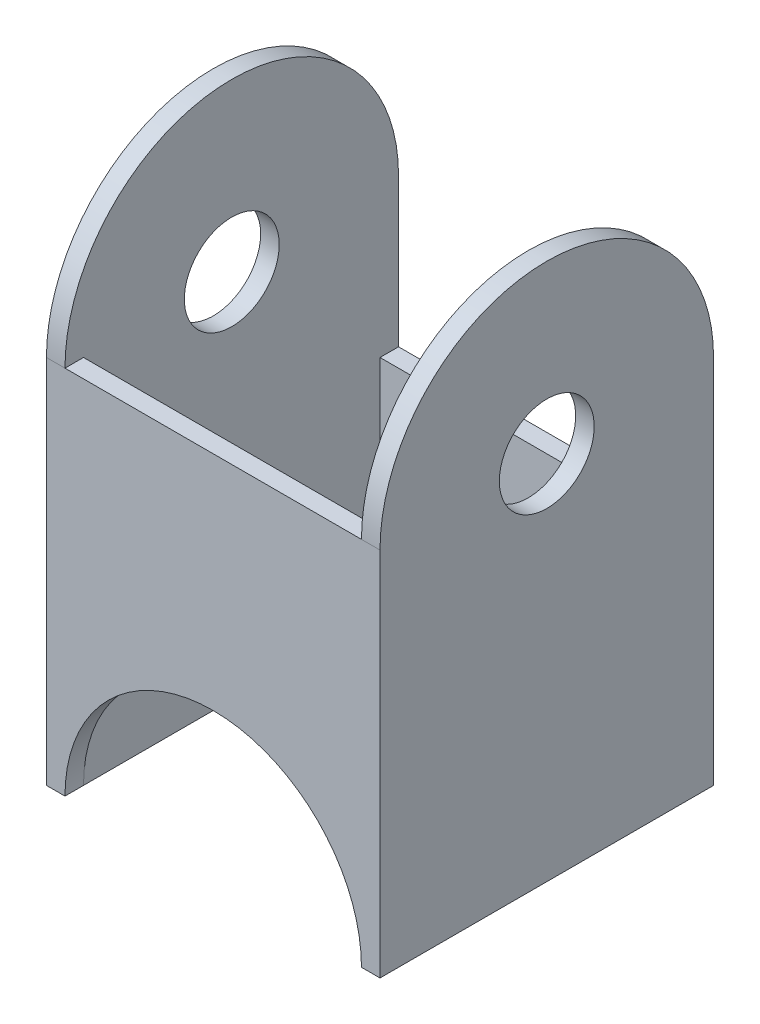
ISO-10303-21;
HEADER;
FILE_DESCRIPTION(('STEP AP214'),'2;1');
FILE_NAME('part.step','',(''),(''),'','','');
FILE_SCHEMA(('AUTOMOTIVE_DESIGN { 1 0 10303 214 1 1 1 1 }'));
ENDSEC;
DATA;
#1=APPLICATION_CONTEXT('core data for automotive mechanical design processes');
#2=APPLICATION_PROTOCOL_DEFINITION('international standard','automotive_design',2000,#1);
#3=PRODUCT_CONTEXT('',#1,'mechanical');
#4=PRODUCT('Part','Part','',(#3));
#5=PRODUCT_RELATED_PRODUCT_CATEGORY('part','',(#4));
#6=PRODUCT_DEFINITION_FORMATION('','',#4);
#7=PRODUCT_DEFINITION_CONTEXT('part definition',#1,'design');
#8=PRODUCT_DEFINITION('design','',#6,#7);
#9=PRODUCT_DEFINITION_SHAPE('','',#8);
#10=(LENGTH_UNIT() NAMED_UNIT(*) SI_UNIT(.MILLI.,.METRE.));
#11=(NAMED_UNIT(*) PLANE_ANGLE_UNIT() SI_UNIT($,.RADIAN.));
#12=(NAMED_UNIT(*) SI_UNIT($,.STERADIAN.) SOLID_ANGLE_UNIT());
#13=UNCERTAINTY_MEASURE_WITH_UNIT(LENGTH_MEASURE(1.E-05),#10,'distance_accuracy_value','');
#14=(GEOMETRIC_REPRESENTATION_CONTEXT(3) GLOBAL_UNCERTAINTY_ASSIGNED_CONTEXT((#13)) GLOBAL_UNIT_ASSIGNED_CONTEXT((#10,
#11,#12)) REPRESENTATION_CONTEXT('',''));
#15=CARTESIAN_POINT('',(0.,0.,0.));
#16=DIRECTION('',(0.,0.,1.));
#17=DIRECTION('',(1.,0.,0.));
#18=AXIS2_PLACEMENT_3D('',#15,#16,#17);
#19=CARTESIAN_POINT('',(0.,0.,0.));
#20=DIRECTION('',(0.,1.,0.));
#21=DIRECTION('',(0.,0.,1.));
#22=AXIS2_PLACEMENT_3D('',#19,#20,#21);
#23=PLANE('',#22);
#24=DIRECTION('',(-1.,0.,0.));
#25=VECTOR('',#24,1.);
#26=CARTESIAN_POINT('',(-14.2875,0.,-14.2875));
#27=LINE('',#26,#25);
#28=CARTESIAN_POINT('',(-12.7,0.,-14.2875));
#29=VERTEX_POINT('',#28);
#30=CARTESIAN_POINT('',(-14.2875,0.,-14.2875));
#31=VERTEX_POINT('',#30);
#32=EDGE_CURVE('E239',#29,#31,#27,.T.);
#33=ORIENTED_EDGE('',*,*,#32,.F.);
#34=DIRECTION('',(0.,0.,1.));
#35=VECTOR('',#34,1.);
#36=CARTESIAN_POINT('',(-12.7,0.,-14.2875));
#37=LINE('',#36,#35);
#38=CARTESIAN_POINT('',(-12.7,0.,-12.7));
#39=VERTEX_POINT('',#38);
#40=EDGE_CURVE('E182',#29,#39,#37,.T.);
#41=ORIENTED_EDGE('',*,*,#40,.T.);
#42=DIRECTION('',(0.,0.,1.));
#43=VECTOR('',#42,1.);
#44=CARTESIAN_POINT('',(-12.7,0.,-12.7));
#45=LINE('',#44,#43);
#46=CARTESIAN_POINT('',(-12.7,0.,12.7));
#47=VERTEX_POINT('',#46);
#48=EDGE_CURVE('E216',#39,#47,#45,.T.);
#49=ORIENTED_EDGE('',*,*,#48,.T.);
#50=CARTESIAN_POINT('',(-12.7,0.,14.2875));
#51=VERTEX_POINT('',#50);
#52=EDGE_CURVE('E179',#47,#51,#37,.T.);
#53=ORIENTED_EDGE('',*,*,#52,.T.);
#54=DIRECTION('',(1.,0.,0.));
#55=VECTOR('',#54,1.);
#56=CARTESIAN_POINT('',(-14.2875,0.,14.2875));
#57=LINE('',#56,#55);
#58=CARTESIAN_POINT('',(-14.2875,0.,14.2875));
#59=VERTEX_POINT('',#58);
#60=EDGE_CURVE('E232',#59,#51,#57,.T.);
#61=ORIENTED_EDGE('',*,*,#60,.F.);
#62=DIRECTION('',(0.,0.,1.));
#63=VECTOR('',#62,1.);
#64=CARTESIAN_POINT('',(-14.2875,0.,-14.2875));
#65=LINE('',#64,#63);
#66=EDGE_CURVE('E243',#31,#59,#65,.T.);
#67=ORIENTED_EDGE('',*,*,#66,.F.);
#68=EDGE_LOOP('',(#33,#41,#49,#53,#61,#67));
#69=FACE_BOUND('',#68,.T.);
#70=ADVANCED_FACE('F39',(#69),#23,.F.);
#71=CARTESIAN_POINT('',(0.,31.75,0.));
#72=DIRECTION('',(0.,1.,0.));
#73=DIRECTION('',(0.,0.,1.));
#74=AXIS2_PLACEMENT_3D('',#71,#72,#73);
#75=PLANE('',#74);
#76=DIRECTION('',(0.,0.,1.));
#77=VECTOR('',#76,1.);
#78=CARTESIAN_POINT('',(12.7,31.75,0.));
#79=LINE('',#78,#77);
#80=CARTESIAN_POINT('',(12.7,31.75,12.7));
#81=VERTEX_POINT('',#80);
#82=CARTESIAN_POINT('',(12.7,31.75,14.2875));
#83=VERTEX_POINT('',#82);
#84=EDGE_CURVE('E199',#81,#83,#79,.T.);
#85=ORIENTED_EDGE('',*,*,#84,.F.);
#86=DIRECTION('',(1.,0.,0.));
#87=VECTOR('',#86,1.);
#88=CARTESIAN_POINT('',(-12.7,31.75,12.7));
#89=LINE('',#88,#87);
#90=CARTESIAN_POINT('',(-12.7,31.75,12.7));
#91=VERTEX_POINT('',#90);
#92=EDGE_CURVE('E213',#91,#81,#89,.T.);
#93=ORIENTED_EDGE('',*,*,#92,.F.);
#94=DIRECTION('',(0.,0.,-1.));
#95=VECTOR('',#94,1.);
#96=CARTESIAN_POINT('',(-12.7,31.75,0.));
#97=LINE('',#96,#95);
#98=CARTESIAN_POINT('',(-12.7,31.75,14.2875));
#99=VERTEX_POINT('',#98);
#100=EDGE_CURVE('E208',#99,#91,#97,.T.);
#101=ORIENTED_EDGE('',*,*,#100,.F.);
#102=DIRECTION('',(1.,0.,0.));
#103=VECTOR('',#102,1.);
#104=CARTESIAN_POINT('',(-14.2875,31.75,14.2875));
#105=LINE('',#104,#103);
#106=EDGE_CURVE('E231',#99,#83,#105,.T.);
#107=ORIENTED_EDGE('',*,*,#106,.T.);
#108=EDGE_LOOP('',(#85,#93,#101,#107));
#109=FACE_BOUND('',#108,.T.);
#110=ADVANCED_FACE('F277',(#109),#75,.T.);
#111=CARTESIAN_POINT('',(12.7,0.,14.2875));
#112=VERTEX_POINT('',#111);
#113=CARTESIAN_POINT('',(14.2875,0.,14.2875));
#114=VERTEX_POINT('',#113);
#115=EDGE_CURVE('E245',#112,#114,#57,.T.);
#116=ORIENTED_EDGE('',*,*,#115,.F.);
#117=DIRECTION('',(0.,0.,1.));
#118=VECTOR('',#117,1.);
#119=CARTESIAN_POINT('',(12.7,0.,-14.2875));
#120=LINE('',#119,#118);
#121=CARTESIAN_POINT('',(12.7,0.,12.7));
#122=VERTEX_POINT('',#121);
#123=EDGE_CURVE('E176',#112,#122,#120,.F.);
#124=ORIENTED_EDGE('',*,*,#123,.T.);
#125=DIRECTION('',(0.,0.,-1.));
#126=VECTOR('',#125,1.);
#127=CARTESIAN_POINT('',(12.7,0.,-12.7));
#128=LINE('',#127,#126);
#129=CARTESIAN_POINT('',(12.7,0.,-12.7));
#130=VERTEX_POINT('',#129);
#131=EDGE_CURVE('E212',#122,#130,#128,.T.);
#132=ORIENTED_EDGE('',*,*,#131,.T.);
#133=CARTESIAN_POINT('',(12.7,0.,-14.2875));
#134=VERTEX_POINT('',#133);
#135=EDGE_CURVE('E172',#130,#134,#120,.F.);
#136=ORIENTED_EDGE('',*,*,#135,.T.);
#137=CARTESIAN_POINT('',(14.2875,0.,-14.2875));
#138=VERTEX_POINT('',#137);
#139=EDGE_CURVE('E240',#138,#134,#27,.T.);
#140=ORIENTED_EDGE('',*,*,#139,.F.);
#141=DIRECTION('',(0.,0.,-1.));
#142=VECTOR('',#141,1.);
#143=CARTESIAN_POINT('',(14.2875,0.,-14.2875));
#144=LINE('',#143,#142);
#145=EDGE_CURVE('E227',#114,#138,#144,.T.);
#146=ORIENTED_EDGE('',*,*,#145,.F.);
#147=EDGE_LOOP('',(#116,#124,#132,#136,#140,#146));
#148=FACE_BOUND('',#147,.T.);
#149=ADVANCED_FACE('F280',(#148),#23,.F.);
#150=CARTESIAN_POINT('',(14.2875,31.75,-14.2875));
#151=DIRECTION('',(-1.,0.,0.));
#152=DIRECTION('',(0.,0.,1.));
#153=AXIS2_PLACEMENT_3D('',#150,#151,#152);
#154=PLANE('',#153);
#155=CARTESIAN_POINT('',(14.2875,31.75,0.));
#156=DIRECTION('',(-1.,0.,0.));
#157=DIRECTION('',(0.,0.,1.));
#158=AXIS2_PLACEMENT_3D('',#155,#156,#157);
#159=CIRCLE('',#158,4.064);
#160=CARTESIAN_POINT('',(14.2875,31.75,4.064));
#161=VERTEX_POINT('',#160);
#162=EDGE_CURVE('E183',#161,#161,#159,.T.);
#163=ORIENTED_EDGE('',*,*,#162,.T.);
#164=EDGE_LOOP('',(#163));
#165=FACE_BOUND('',#164,.T.);
#166=DIRECTION('',(0.,-1.,0.));
#167=VECTOR('',#166,1.);
#168=CARTESIAN_POINT('',(14.2875,31.75,-14.2875));
#169=LINE('',#168,#167);
#170=CARTESIAN_POINT('',(14.2875,31.75,-14.2875));
#171=VERTEX_POINT('',#170);
#172=EDGE_CURVE('E47',#171,#138,#169,.T.);
#173=ORIENTED_EDGE('',*,*,#172,.F.);
#174=CARTESIAN_POINT('',(14.2875,31.75,0.));
#175=DIRECTION('',(1.,0.,0.));
#176=DIRECTION('',(0.,0.,-1.));
#177=AXIS2_PLACEMENT_3D('',#174,#175,#176);
#178=CIRCLE('',#177,14.2875);
#179=CARTESIAN_POINT('',(14.2875,31.75,14.2875));
#180=VERTEX_POINT('',#179);
#181=EDGE_CURVE('E193',#171,#180,#178,.T.);
#182=ORIENTED_EDGE('',*,*,#181,.T.);
#183=DIRECTION('',(0.,-1.,0.));
#184=VECTOR('',#183,1.);
#185=CARTESIAN_POINT('',(14.2875,31.75,14.2875));
#186=LINE('',#185,#184);
#187=EDGE_CURVE('E236',#180,#114,#186,.T.);
#188=ORIENTED_EDGE('',*,*,#187,.T.);
#189=ORIENTED_EDGE('',*,*,#145,.T.);
#190=EDGE_LOOP('',(#173,#182,#188,#189));
#191=FACE_BOUND('',#190,.T.);
#192=ADVANCED_FACE('F41',(#165,#191),#154,.F.);
#193=CARTESIAN_POINT('',(-14.2875,31.75,-14.2875));
#194=DIRECTION('',(0.,0.,1.));
#195=DIRECTION('',(1.,0.,0.));
#196=AXIS2_PLACEMENT_3D('',#193,#194,#195);
#197=PLANE('',#196);
#198=DIRECTION('',(-1.,0.,0.));
#199=VECTOR('',#198,1.);
#200=CARTESIAN_POINT('',(27.7111525448112,31.75,-14.2875));
#201=LINE('',#200,#199);
#202=CARTESIAN_POINT('',(-12.7,31.75,-14.2875));
#203=VERTEX_POINT('',#202);
#204=CARTESIAN_POINT('',(-14.2875,31.75,-14.2875));
#205=VERTEX_POINT('',#204);
#206=EDGE_CURVE('E159',#203,#205,#201,.T.);
#207=ORIENTED_EDGE('',*,*,#206,.F.);
#208=DIRECTION('',(0.,1.,0.));
#209=VECTOR('',#208,1.);
#210=CARTESIAN_POINT('',(-12.7,31.75,-14.2875));
#211=LINE('',#210,#209);
#212=CARTESIAN_POINT('',(-12.7,19.05,-14.2875));
#213=VERTEX_POINT('',#212);
#214=EDGE_CURVE('E140',#213,#203,#211,.T.);
#215=ORIENTED_EDGE('',*,*,#214,.F.);
#216=DIRECTION('',(-1.,0.,0.));
#217=VECTOR('',#216,1.);
#218=CARTESIAN_POINT('',(-12.7,19.05,-14.2875));
#219=LINE('',#218,#217);
#220=CARTESIAN_POINT('',(12.7,19.05,-14.2875));
#221=VERTEX_POINT('',#220);
#222=EDGE_CURVE('E151',#221,#213,#219,.T.);
#223=ORIENTED_EDGE('',*,*,#222,.F.);
#224=DIRECTION('',(0.,-1.,0.));
#225=VECTOR('',#224,1.);
#226=CARTESIAN_POINT('',(12.7,31.75,-14.2875));
#227=LINE('',#226,#225);
#228=CARTESIAN_POINT('',(12.7,31.75,-14.2875));
#229=VERTEX_POINT('',#228);
#230=EDGE_CURVE('E161',#229,#221,#227,.T.);
#231=ORIENTED_EDGE('',*,*,#230,.F.);
#232=DIRECTION('',(-1.,0.,0.));
#233=VECTOR('',#232,1.);
#234=CARTESIAN_POINT('',(-14.2875,31.75,-14.2875));
#235=LINE('',#234,#233);
#236=EDGE_CURVE('E228',#171,#229,#235,.T.);
#237=ORIENTED_EDGE('',*,*,#236,.F.);
#238=ORIENTED_EDGE('',*,*,#172,.T.);
#239=ORIENTED_EDGE('',*,*,#139,.T.);
#240=CARTESIAN_POINT('',(0.,0.,-14.2875));
#241=DIRECTION('',(0.,0.,1.));
#242=DIRECTION('',(1.,0.,0.));
#243=AXIS2_PLACEMENT_3D('',#240,#241,#242);
#244=CIRCLE('',#243,12.7);
#245=EDGE_CURVE('E155',#134,#29,#244,.T.);
#246=ORIENTED_EDGE('',*,*,#245,.T.);
#247=ORIENTED_EDGE('',*,*,#32,.T.);
#248=DIRECTION('',(0.,-1.,0.));
#249=VECTOR('',#248,1.);
#250=CARTESIAN_POINT('',(-14.2875,31.75,-14.2875));
#251=LINE('',#250,#249);
#252=EDGE_CURVE('E253',#205,#31,#251,.T.);
#253=ORIENTED_EDGE('',*,*,#252,.F.);
#254=EDGE_LOOP('',(#207,#215,#223,#231,#237,#238,#239,#246,#247,#253));
#255=FACE_BOUND('',#254,.T.);
#256=ADVANCED_FACE('F157',(#255),#197,.F.);
#257=CARTESIAN_POINT('',(-14.2875,31.75,-14.2875));
#258=DIRECTION('',(1.,0.,0.));
#259=DIRECTION('',(0.,0.,-1.));
#260=AXIS2_PLACEMENT_3D('',#257,#258,#259);
#261=PLANE('',#260);
#262=CARTESIAN_POINT('',(-14.2875,31.75,0.));
#263=DIRECTION('',(1.,0.,0.));
#264=DIRECTION('',(0.,0.,-1.));
#265=AXIS2_PLACEMENT_3D('',#262,#263,#264);
#266=CIRCLE('',#265,4.064);
#267=CARTESIAN_POINT('',(-14.2875,31.75,-4.064));
#268=VERTEX_POINT('',#267);
#269=EDGE_CURVE('E190',#268,#268,#266,.T.);
#270=ORIENTED_EDGE('',*,*,#269,.T.);
#271=EDGE_LOOP('',(#270));
#272=FACE_BOUND('',#271,.T.);
#273=DIRECTION('',(0.,-1.,0.));
#274=VECTOR('',#273,1.);
#275=CARTESIAN_POINT('',(-14.2875,31.75,14.2875));
#276=LINE('',#275,#274);
#277=CARTESIAN_POINT('',(-14.2875,31.75,14.2875));
#278=VERTEX_POINT('',#277);
#279=EDGE_CURVE('E250',#278,#59,#276,.T.);
#280=ORIENTED_EDGE('',*,*,#279,.F.);
#281=CARTESIAN_POINT('',(-14.2875,31.75,0.));
#282=DIRECTION('',(-1.,0.,0.));
#283=DIRECTION('',(0.,0.,1.));
#284=AXIS2_PLACEMENT_3D('',#281,#282,#283);
#285=CIRCLE('',#284,14.2875);
#286=EDGE_CURVE('E203',#278,#205,#285,.T.);
#287=ORIENTED_EDGE('',*,*,#286,.T.);
#288=ORIENTED_EDGE('',*,*,#252,.T.);
#289=ORIENTED_EDGE('',*,*,#66,.T.);
#290=EDGE_LOOP('',(#280,#287,#288,#289));
#291=FACE_BOUND('',#290,.T.);
#292=ADVANCED_FACE('F318',(#272,#291),#261,.F.);
#293=CARTESIAN_POINT('',(-14.2875,31.75,14.2875));
#294=DIRECTION('',(0.,0.,-1.));
#295=DIRECTION('',(-1.,0.,0.));
#296=AXIS2_PLACEMENT_3D('',#293,#294,#295);
#297=PLANE('',#296);
#298=ORIENTED_EDGE('',*,*,#60,.T.);
#299=CARTESIAN_POINT('',(0.,0.,14.2875));
#300=DIRECTION('',(0.,0.,-1.));
#301=DIRECTION('',(-1.,0.,0.));
#302=AXIS2_PLACEMENT_3D('',#299,#300,#301);
#303=CIRCLE('',#302,12.7);
#304=EDGE_CURVE('E175',#51,#112,#303,.T.);
#305=ORIENTED_EDGE('',*,*,#304,.T.);
#306=ORIENTED_EDGE('',*,*,#115,.T.);
#307=ORIENTED_EDGE('',*,*,#187,.F.);
#308=DIRECTION('',(1.,0.,0.));
#309=VECTOR('',#308,1.);
#310=CARTESIAN_POINT('',(-27.7111525448112,31.75,14.2875));
#311=LINE('',#310,#309);
#312=EDGE_CURVE('E54',#83,#180,#311,.T.);
#313=ORIENTED_EDGE('',*,*,#312,.F.);
#314=ORIENTED_EDGE('',*,*,#106,.F.);
#315=EDGE_CURVE('E233',#278,#99,#105,.T.);
#316=ORIENTED_EDGE('',*,*,#315,.F.);
#317=ORIENTED_EDGE('',*,*,#279,.T.);
#318=EDGE_LOOP('',(#298,#305,#306,#307,#313,#314,#316,#317));
#319=FACE_BOUND('',#318,.T.);
#320=ADVANCED_FACE('F299',(#319),#297,.F.);
#321=CARTESIAN_POINT('',(12.7,31.75,-12.7));
#322=DIRECTION('',(-1.,0.,0.));
#323=DIRECTION('',(0.,0.,1.));
#324=AXIS2_PLACEMENT_3D('',#321,#322,#323);
#325=PLANE('',#324);
#326=CARTESIAN_POINT('',(12.7,31.75,0.));
#327=DIRECTION('',(-1.,0.,0.));
#328=DIRECTION('',(0.,0.,1.));
#329=AXIS2_PLACEMENT_3D('',#326,#327,#328);
#330=CIRCLE('',#329,4.064);
#331=CARTESIAN_POINT('',(12.7,31.75,4.064));
#332=VERTEX_POINT('',#331);
#333=EDGE_CURVE('E187',#332,#332,#330,.T.);
#334=ORIENTED_EDGE('',*,*,#333,.F.);
#335=EDGE_LOOP('',(#334));
#336=FACE_BOUND('',#335,.T.);
#337=ORIENTED_EDGE('',*,*,#131,.F.);
#338=DIRECTION('',(0.,-1.,0.));
#339=VECTOR('',#338,1.);
#340=CARTESIAN_POINT('',(12.7,31.75,12.7));
#341=LINE('',#340,#339);
#342=EDGE_CURVE('E215',#81,#122,#341,.T.);
#343=ORIENTED_EDGE('',*,*,#342,.F.);
#344=ORIENTED_EDGE('',*,*,#84,.T.);
#345=CARTESIAN_POINT('',(12.7,31.75,0.));
#346=DIRECTION('',(-1.,0.,0.));
#347=DIRECTION('',(0.,0.,1.));
#348=AXIS2_PLACEMENT_3D('',#345,#346,#347);
#349=CIRCLE('',#348,14.2875);
#350=EDGE_CURVE('E196',#229,#83,#349,.F.);
#351=ORIENTED_EDGE('',*,*,#350,.F.);
#352=ORIENTED_EDGE('',*,*,#230,.T.);
#353=DIRECTION('',(0.,0.,1.));
#354=VECTOR('',#353,1.);
#355=CARTESIAN_POINT('',(12.7,19.05,-14.2885));
#356=LINE('',#355,#354);
#357=CARTESIAN_POINT('',(12.7,19.05,-12.7));
#358=VERTEX_POINT('',#357);
#359=EDGE_CURVE('E147',#221,#358,#356,.T.);
#360=ORIENTED_EDGE('',*,*,#359,.T.);
#361=DIRECTION('',(0.,-1.,0.));
#362=VECTOR('',#361,1.);
#363=CARTESIAN_POINT('',(12.7,31.75,-12.7));
#364=LINE('',#363,#362);
#365=EDGE_CURVE('E225',#358,#130,#364,.T.);
#366=ORIENTED_EDGE('',*,*,#365,.T.);
#367=EDGE_LOOP('',(#337,#343,#344,#351,#352,#360,#366));
#368=FACE_BOUND('',#367,.T.);
#369=ADVANCED_FACE('F273',(#336,#368),#325,.T.);
#370=CARTESIAN_POINT('',(-12.7,31.75,-12.7));
#371=DIRECTION('',(0.,0.,1.));
#372=DIRECTION('',(1.,0.,0.));
#373=AXIS2_PLACEMENT_3D('',#370,#371,#372);
#374=PLANE('',#373);
#375=DIRECTION('',(1.,0.,0.));
#376=VECTOR('',#375,1.);
#377=CARTESIAN_POINT('',(-12.7,19.05,-12.7));
#378=LINE('',#377,#376);
#379=CARTESIAN_POINT('',(-12.7,19.05,-12.7));
#380=VERTEX_POINT('',#379);
#381=EDGE_CURVE('E148',#380,#358,#378,.T.);
#382=ORIENTED_EDGE('',*,*,#381,.F.);
#383=DIRECTION('',(0.,-1.,0.));
#384=VECTOR('',#383,1.);
#385=CARTESIAN_POINT('',(-12.7,31.75,-12.7));
#386=LINE('',#385,#384);
#387=EDGE_CURVE('E143',#380,#39,#386,.T.);
#388=ORIENTED_EDGE('',*,*,#387,.T.);
#389=CARTESIAN_POINT('',(0.,0.,-12.7));
#390=DIRECTION('',(0.,0.,1.));
#391=DIRECTION('',(1.,0.,0.));
#392=AXIS2_PLACEMENT_3D('',#389,#390,#391);
#393=CIRCLE('',#392,12.7);
#394=EDGE_CURVE('E169',#130,#39,#393,.T.);
#395=ORIENTED_EDGE('',*,*,#394,.F.);
#396=ORIENTED_EDGE('',*,*,#365,.F.);
#397=EDGE_LOOP('',(#382,#388,#395,#396));
#398=FACE_BOUND('',#397,.T.);
#399=ADVANCED_FACE('F264',(#398),#374,.T.);
#400=CARTESIAN_POINT('',(-12.7,31.75,-12.7));
#401=DIRECTION('',(1.,0.,0.));
#402=DIRECTION('',(0.,0.,-1.));
#403=AXIS2_PLACEMENT_3D('',#400,#401,#402);
#404=PLANE('',#403);
#405=ORIENTED_EDGE('',*,*,#214,.T.);
#406=CARTESIAN_POINT('',(-12.7,31.75,0.));
#407=DIRECTION('',(1.,0.,0.));
#408=DIRECTION('',(0.,0.,-1.));
#409=AXIS2_PLACEMENT_3D('',#406,#407,#408);
#410=CIRCLE('',#409,14.2875);
#411=EDGE_CURVE('E206',#99,#203,#410,.F.);
#412=ORIENTED_EDGE('',*,*,#411,.F.);
#413=ORIENTED_EDGE('',*,*,#100,.T.);
#414=DIRECTION('',(0.,-1.,0.));
#415=VECTOR('',#414,1.);
#416=CARTESIAN_POINT('',(-12.7,31.75,12.7));
#417=LINE('',#416,#415);
#418=EDGE_CURVE('E62',#91,#47,#417,.T.);
#419=ORIENTED_EDGE('',*,*,#418,.T.);
#420=ORIENTED_EDGE('',*,*,#48,.F.);
#421=ORIENTED_EDGE('',*,*,#387,.F.);
#422=DIRECTION('',(0.,0.,1.));
#423=VECTOR('',#422,1.);
#424=CARTESIAN_POINT('',(-12.7,19.05,-14.2885));
#425=LINE('',#424,#423);
#426=EDGE_CURVE('E134',#213,#380,#425,.T.);
#427=ORIENTED_EDGE('',*,*,#426,.F.);
#428=EDGE_LOOP('',(#405,#412,#413,#419,#420,#421,#427));
#429=FACE_BOUND('',#428,.T.);
#430=CARTESIAN_POINT('',(-12.7,31.75,0.));
#431=DIRECTION('',(1.,0.,0.));
#432=DIRECTION('',(0.,0.,-1.));
#433=AXIS2_PLACEMENT_3D('',#430,#431,#432);
#434=CIRCLE('',#433,4.064);
#435=CARTESIAN_POINT('',(-12.7,31.75,-4.064));
#436=VERTEX_POINT('',#435);
#437=EDGE_CURVE('E186',#436,#436,#434,.T.);
#438=ORIENTED_EDGE('',*,*,#437,.F.);
#439=EDGE_LOOP('',(#438));
#440=FACE_BOUND('',#439,.T.);
#441=ADVANCED_FACE('F136',(#429,#440),#404,.T.);
#442=CARTESIAN_POINT('',(-12.7,31.75,12.7));
#443=DIRECTION('',(0.,0.,-1.));
#444=DIRECTION('',(-1.,0.,0.));
#445=AXIS2_PLACEMENT_3D('',#442,#443,#444);
#446=PLANE('',#445);
#447=CARTESIAN_POINT('',(0.,0.,12.7));
#448=DIRECTION('',(0.,0.,-1.));
#449=DIRECTION('',(-1.,0.,0.));
#450=AXIS2_PLACEMENT_3D('',#447,#448,#449);
#451=CIRCLE('',#450,12.7);
#452=EDGE_CURVE('E11',#47,#122,#451,.T.);
#453=ORIENTED_EDGE('',*,*,#452,.F.);
#454=ORIENTED_EDGE('',*,*,#418,.F.);
#455=ORIENTED_EDGE('',*,*,#92,.T.);
#456=ORIENTED_EDGE('',*,*,#342,.T.);
#457=EDGE_LOOP('',(#453,#454,#455,#456));
#458=FACE_BOUND('',#457,.T.);
#459=ADVANCED_FACE('F263',(#458),#446,.T.);
#460=CARTESIAN_POINT('',(27.7111525448112,31.75,0.));
#461=DIRECTION('',(-1.,0.,0.));
#462=DIRECTION('',(0.,0.,1.));
#463=AXIS2_PLACEMENT_3D('',#460,#461,#462);
#464=CYLINDRICAL_SURFACE('',#463,14.2875);
#465=ORIENTED_EDGE('',*,*,#411,.T.);
#466=ORIENTED_EDGE('',*,*,#206,.T.);
#467=ORIENTED_EDGE('',*,*,#286,.F.);
#468=ORIENTED_EDGE('',*,*,#315,.T.);
#469=EDGE_LOOP('',(#465,#466,#467,#468));
#470=FACE_BOUND('',#469,.T.);
#471=ADVANCED_FACE('F271',(#470),#464,.T.);
#472=CARTESIAN_POINT('',(-27.7111525448112,31.75,0.));
#473=DIRECTION('',(1.,0.,0.));
#474=DIRECTION('',(0.,0.,-1.));
#475=AXIS2_PLACEMENT_3D('',#472,#473,#474);
#476=CYLINDRICAL_SURFACE('',#475,14.2875);
#477=ORIENTED_EDGE('',*,*,#236,.T.);
#478=ORIENTED_EDGE('',*,*,#350,.T.);
#479=ORIENTED_EDGE('',*,*,#312,.T.);
#480=ORIENTED_EDGE('',*,*,#181,.F.);
#481=EDGE_LOOP('',(#477,#478,#479,#480));
#482=FACE_BOUND('',#481,.T.);
#483=ADVANCED_FACE('F304',(#482),#476,.T.);
#484=CARTESIAN_POINT('',(14.2875,31.75,0.));
#485=DIRECTION('',(-1.,0.,0.));
#486=DIRECTION('',(0.,0.,1.));
#487=AXIS2_PLACEMENT_3D('',#484,#485,#486);
#488=CYLINDRICAL_SURFACE('',#487,4.064);
#489=ORIENTED_EDGE('',*,*,#437,.T.);
#490=EDGE_LOOP('',(#489));
#491=FACE_BOUND('',#490,.T.);
#492=ORIENTED_EDGE('',*,*,#269,.F.);
#493=EDGE_LOOP('',(#492));
#494=FACE_BOUND('',#493,.T.);
#495=ADVANCED_FACE('F260',(#491,#494),#488,.F.);
#496=ORIENTED_EDGE('',*,*,#333,.T.);
#497=EDGE_LOOP('',(#496));
#498=FACE_BOUND('',#497,.T.);
#499=ORIENTED_EDGE('',*,*,#162,.F.);
#500=EDGE_LOOP('',(#499));
#501=FACE_BOUND('',#500,.T.);
#502=ADVANCED_FACE('F326',(#498,#501),#488,.F.);
#503=CARTESIAN_POINT('',(0.,0.,-14.2875));
#504=DIRECTION('',(0.,0.,1.));
#505=DIRECTION('',(1.,0.,0.));
#506=AXIS2_PLACEMENT_3D('',#503,#504,#505);
#507=CYLINDRICAL_SURFACE('',#506,12.7);
#508=ORIENTED_EDGE('',*,*,#452,.T.);
#509=ORIENTED_EDGE('',*,*,#123,.F.);
#510=ORIENTED_EDGE('',*,*,#304,.F.);
#511=ORIENTED_EDGE('',*,*,#52,.F.);
#512=EDGE_LOOP('',(#508,#509,#510,#511));
#513=FACE_BOUND('',#512,.T.);
#514=ADVANCED_FACE('F323',(#513),#507,.F.);
#515=ORIENTED_EDGE('',*,*,#245,.F.);
#516=ORIENTED_EDGE('',*,*,#135,.F.);
#517=ORIENTED_EDGE('',*,*,#394,.T.);
#518=ORIENTED_EDGE('',*,*,#40,.F.);
#519=EDGE_LOOP('',(#515,#516,#517,#518));
#520=FACE_BOUND('',#519,.T.);
#521=ADVANCED_FACE('F325',(#520),#507,.F.);
#522=CARTESIAN_POINT('',(-12.7,19.05,-14.2885));
#523=DIRECTION('',(0.,-1.,0.));
#524=DIRECTION('',(0.,0.,-1.));
#525=AXIS2_PLACEMENT_3D('',#522,#523,#524);
#526=PLANE('',#525);
#527=ORIENTED_EDGE('',*,*,#222,.T.);
#528=ORIENTED_EDGE('',*,*,#426,.T.);
#529=ORIENTED_EDGE('',*,*,#381,.T.);
#530=ORIENTED_EDGE('',*,*,#359,.F.);
#531=EDGE_LOOP('',(#527,#528,#529,#530));
#532=FACE_BOUND('',#531,.T.);
#533=ADVANCED_FACE('F152',(#532),#526,.F.);
#534=CLOSED_SHELL('',(#70,#110,#149,#192,#256,#292,#320,#369,#399,#441,#459,#471,#483,#495,#502,
#514,#521,#533));
#535=MANIFOLD_SOLID_BREP('B2',#534);
#536=ADVANCED_BREP_SHAPE_REPRESENTATION('',(#18,#535),#14);
#537=SHAPE_DEFINITION_REPRESENTATION(#9,#536);
ENDSEC;
END-ISO-10303-21;
